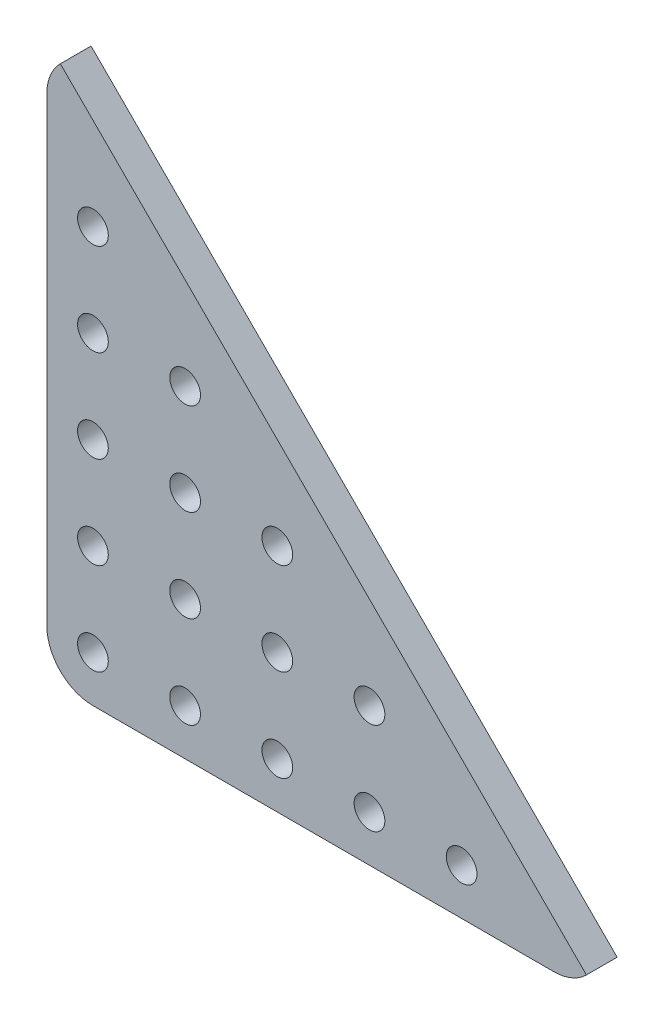
ISO-10303-21;
HEADER;
FILE_DESCRIPTION(('STEP AP214'),'2;1');
FILE_NAME('part.step','',(''),(''),'','','');
FILE_SCHEMA(('AUTOMOTIVE_DESIGN { 1 0 10303 214 1 1 1 1 }'));
ENDSEC;
DATA;
#1=APPLICATION_CONTEXT('core data for automotive mechanical design processes');
#2=APPLICATION_PROTOCOL_DEFINITION('international standard','automotive_design',2000,#1);
#3=PRODUCT_CONTEXT('',#1,'mechanical');
#4=PRODUCT('Part','Part','',(#3));
#5=PRODUCT_RELATED_PRODUCT_CATEGORY('part','',(#4));
#6=PRODUCT_DEFINITION_FORMATION('','',#4);
#7=PRODUCT_DEFINITION_CONTEXT('part definition',#1,'design');
#8=PRODUCT_DEFINITION('design','',#6,#7);
#9=PRODUCT_DEFINITION_SHAPE('','',#8);
#10=(LENGTH_UNIT() NAMED_UNIT(*) SI_UNIT(.MILLI.,.METRE.));
#11=(NAMED_UNIT(*) PLANE_ANGLE_UNIT() SI_UNIT($,.RADIAN.));
#12=(NAMED_UNIT(*) SI_UNIT($,.STERADIAN.) SOLID_ANGLE_UNIT());
#13=UNCERTAINTY_MEASURE_WITH_UNIT(LENGTH_MEASURE(1.E-05),#10,'distance_accuracy_value','');
#14=(GEOMETRIC_REPRESENTATION_CONTEXT(3) GLOBAL_UNCERTAINTY_ASSIGNED_CONTEXT((#13)) GLOBAL_UNIT_ASSIGNED_CONTEXT((#10,
#11,#12)) REPRESENTATION_CONTEXT('',''));
#15=CARTESIAN_POINT('',(0.,0.,0.));
#16=DIRECTION('',(0.,0.,1.));
#17=DIRECTION('',(1.,0.,0.));
#18=AXIS2_PLACEMENT_3D('',#15,#16,#17);
#19=CARTESIAN_POINT('',(-101.443383637,101.056539337921,3.));
#20=DIRECTION('',(0.,0.,1.));
#21=DIRECTION('',(1.,0.,0.));
#22=AXIS2_PLACEMENT_3D('',#19,#20,#21);
#23=PLANE('',#22);
#24=CARTESIAN_POINT('',(-74.443383637,56.056539338,3.));
#25=DIRECTION('',(0.,0.,1.));
#26=DIRECTION('',(1.,0.,0.));
#27=AXIS2_PLACEMENT_3D('',#24,#25,#26);
#28=CIRCLE('',#27,1.5);
#29=CARTESIAN_POINT('',(-72.943383637,56.056539338,3.));
#30=VERTEX_POINT('',#29);
#31=EDGE_CURVE('E234',#30,#30,#28,.T.);
#32=ORIENTED_EDGE('',*,*,#31,.F.);
#33=EDGE_LOOP('',(#32));
#34=FACE_BOUND('',#33,.T.);
#35=CARTESIAN_POINT('',(-92.443383637,56.056539338,3.));
#36=DIRECTION('',(0.,0.,1.));
#37=DIRECTION('',(1.,0.,0.));
#38=AXIS2_PLACEMENT_3D('',#35,#36,#37);
#39=CIRCLE('',#38,1.5);
#40=CARTESIAN_POINT('',(-90.943383637,56.056539338,3.));
#41=VERTEX_POINT('',#40);
#42=EDGE_CURVE('E246',#41,#41,#39,.T.);
#43=ORIENTED_EDGE('',*,*,#42,.F.);
#44=EDGE_LOOP('',(#43));
#45=FACE_BOUND('',#44,.T.);
#46=CARTESIAN_POINT('',(-74.443383637,65.056539338,3.));
#47=DIRECTION('',(0.,0.,1.));
#48=DIRECTION('',(1.,0.,0.));
#49=AXIS2_PLACEMENT_3D('',#46,#47,#48);
#50=CIRCLE('',#49,1.5);
#51=CARTESIAN_POINT('',(-72.943383637,65.056539338,3.));
#52=VERTEX_POINT('',#51);
#53=EDGE_CURVE('E258',#52,#52,#50,.T.);
#54=ORIENTED_EDGE('',*,*,#53,.F.);
#55=EDGE_LOOP('',(#54));
#56=FACE_BOUND('',#55,.T.);
#57=CARTESIAN_POINT('',(-92.443383637,65.056539338,3.));
#58=DIRECTION('',(0.,0.,1.));
#59=DIRECTION('',(1.,0.,0.));
#60=AXIS2_PLACEMENT_3D('',#57,#58,#59);
#61=CIRCLE('',#60,1.5);
#62=CARTESIAN_POINT('',(-90.943383637,65.056539338,3.));
#63=VERTEX_POINT('',#62);
#64=EDGE_CURVE('E270',#63,#63,#61,.T.);
#65=ORIENTED_EDGE('',*,*,#64,.F.);
#66=EDGE_LOOP('',(#65));
#67=FACE_BOUND('',#66,.T.);
#68=CARTESIAN_POINT('',(-83.443383637,74.056539338,3.));
#69=DIRECTION('',(0.,0.,1.));
#70=DIRECTION('',(1.,0.,0.));
#71=AXIS2_PLACEMENT_3D('',#68,#69,#70);
#72=CIRCLE('',#71,1.5);
#73=CARTESIAN_POINT('',(-81.943383637,74.056539338,3.));
#74=VERTEX_POINT('',#73);
#75=EDGE_CURVE('E282',#74,#74,#72,.T.);
#76=ORIENTED_EDGE('',*,*,#75,.F.);
#77=EDGE_LOOP('',(#76));
#78=FACE_BOUND('',#77,.T.);
#79=CARTESIAN_POINT('',(-101.443383637,74.056539338,3.));
#80=DIRECTION('',(0.,0.,1.));
#81=DIRECTION('',(1.,0.,0.));
#82=AXIS2_PLACEMENT_3D('',#79,#80,#81);
#83=CIRCLE('',#82,1.5);
#84=CARTESIAN_POINT('',(-99.943383637,74.056539338,3.));
#85=VERTEX_POINT('',#84);
#86=EDGE_CURVE('E294',#85,#85,#83,.T.);
#87=ORIENTED_EDGE('',*,*,#86,.F.);
#88=EDGE_LOOP('',(#87));
#89=FACE_BOUND('',#88,.T.);
#90=CARTESIAN_POINT('',(-101.443383637,83.056539338,3.));
#91=DIRECTION('',(0.,0.,1.));
#92=DIRECTION('',(1.,0.,0.));
#93=AXIS2_PLACEMENT_3D('',#90,#91,#92);
#94=CIRCLE('',#93,1.5);
#95=CARTESIAN_POINT('',(-99.943383637,83.056539338,3.));
#96=VERTEX_POINT('',#95);
#97=EDGE_CURVE('E306',#96,#96,#94,.T.);
#98=ORIENTED_EDGE('',*,*,#97,.F.);
#99=EDGE_LOOP('',(#98));
#100=FACE_BOUND('',#99,.T.);
#101=CARTESIAN_POINT('',(-101.443383637,101.056539337921,3.));
#102=DIRECTION('',(0.,0.,1.));
#103=DIRECTION('',(1.,0.,0.));
#104=AXIS2_PLACEMENT_3D('',#101,#102,#103);
#105=CIRCLE('',#104,4.50000000000001);
#106=CARTESIAN_POINT('',(-104.6253641523,104.2385198533,3.));
#107=VERTEX_POINT('',#106);
#108=CARTESIAN_POINT('',(-105.943383637,101.056539338,3.));
#109=VERTEX_POINT('',#108);
#110=EDGE_CURVE('E129',#107,#109,#105,.T.);
#111=ORIENTED_EDGE('',*,*,#110,.T.);
#112=DIRECTION('',(0.,-1.,0.));
#113=VECTOR('',#112,1.);
#114=CARTESIAN_POINT('',(-105.943383637,101.056539338,3.));
#115=LINE('',#114,#113);
#116=CARTESIAN_POINT('',(-105.943383637,56.056539338,3.));
#117=VERTEX_POINT('',#116);
#118=EDGE_CURVE('E87',#109,#117,#115,.T.);
#119=ORIENTED_EDGE('',*,*,#118,.T.);
#120=CARTESIAN_POINT('',(-101.443383637,56.056539338,3.));
#121=DIRECTION('',(0.,0.,1.));
#122=DIRECTION('',(1.,0.,0.));
#123=AXIS2_PLACEMENT_3D('',#120,#121,#122);
#124=CIRCLE('',#123,4.5);
#125=CARTESIAN_POINT('',(-101.443383637,51.556539338,3.));
#126=VERTEX_POINT('',#125);
#127=EDGE_CURVE('E100',#117,#126,#124,.T.);
#128=ORIENTED_EDGE('',*,*,#127,.T.);
#129=DIRECTION('',(1.,0.,0.));
#130=VECTOR('',#129,1.);
#131=CARTESIAN_POINT('',(-101.443383637,51.556539338,3.));
#132=LINE('',#131,#130);
#133=CARTESIAN_POINT('',(-56.443383637,51.556539338,3.));
#134=VERTEX_POINT('',#133);
#135=EDGE_CURVE('E94',#126,#134,#132,.T.);
#136=ORIENTED_EDGE('',*,*,#135,.T.);
#137=CARTESIAN_POINT('',(-56.4433836370789,56.056539338,3.));
#138=DIRECTION('',(0.,0.,1.));
#139=DIRECTION('',(1.,0.,0.));
#140=AXIS2_PLACEMENT_3D('',#137,#138,#139);
#141=CIRCLE('',#140,4.5);
#142=CARTESIAN_POINT('',(-53.2614031217,52.8745588227,3.));
#143=VERTEX_POINT('',#142);
#144=EDGE_CURVE('E98',#134,#143,#141,.T.);
#145=ORIENTED_EDGE('',*,*,#144,.T.);
#146=DIRECTION('',(-0.707106781186547,0.707106781186548,0.));
#147=VECTOR('',#146,1.);
#148=CARTESIAN_POINT('',(-104.6253641523,104.2385198533,3.));
#149=LINE('',#148,#147);
#150=EDGE_CURVE('E50',#143,#107,#149,.T.);
#151=ORIENTED_EDGE('',*,*,#150,.T.);
#152=EDGE_LOOP('',(#111,#119,#128,#136,#145,#151));
#153=FACE_BOUND('',#152,.T.);
#154=CARTESIAN_POINT('',(-101.443383637,92.056539338,3.));
#155=DIRECTION('',(0.,0.,1.));
#156=DIRECTION('',(1.,0.,0.));
#157=AXIS2_PLACEMENT_3D('',#154,#155,#156);
#158=CIRCLE('',#157,1.5);
#159=CARTESIAN_POINT('',(-99.943383637,92.056539338,3.));
#160=VERTEX_POINT('',#159);
#161=EDGE_CURVE('E122',#160,#160,#158,.T.);
#162=ORIENTED_EDGE('',*,*,#161,.F.);
#163=EDGE_LOOP('',(#162));
#164=FACE_BOUND('',#163,.T.);
#165=CARTESIAN_POINT('',(-92.443383637,83.056539338,3.));
#166=DIRECTION('',(0.,0.,1.));
#167=DIRECTION('',(1.,0.,0.));
#168=AXIS2_PLACEMENT_3D('',#165,#166,#167);
#169=CIRCLE('',#168,1.5);
#170=CARTESIAN_POINT('',(-90.943383637,83.056539338,3.));
#171=VERTEX_POINT('',#170);
#172=EDGE_CURVE('E300',#171,#171,#169,.T.);
#173=ORIENTED_EDGE('',*,*,#172,.F.);
#174=EDGE_LOOP('',(#173));
#175=FACE_BOUND('',#174,.T.);
#176=CARTESIAN_POINT('',(-92.443383637,74.056539338,3.));
#177=DIRECTION('',(0.,0.,1.));
#178=DIRECTION('',(1.,0.,0.));
#179=AXIS2_PLACEMENT_3D('',#176,#177,#178);
#180=CIRCLE('',#179,1.5);
#181=CARTESIAN_POINT('',(-90.943383637,74.056539338,3.));
#182=VERTEX_POINT('',#181);
#183=EDGE_CURVE('E288',#182,#182,#180,.T.);
#184=ORIENTED_EDGE('',*,*,#183,.F.);
#185=EDGE_LOOP('',(#184));
#186=FACE_BOUND('',#185,.T.);
#187=CARTESIAN_POINT('',(-101.443383637,65.056539338,3.));
#188=DIRECTION('',(0.,0.,1.));
#189=DIRECTION('',(1.,0.,0.));
#190=AXIS2_PLACEMENT_3D('',#187,#188,#189);
#191=CIRCLE('',#190,1.5);
#192=CARTESIAN_POINT('',(-99.943383637,65.056539338,3.));
#193=VERTEX_POINT('',#192);
#194=EDGE_CURVE('E276',#193,#193,#191,.T.);
#195=ORIENTED_EDGE('',*,*,#194,.F.);
#196=EDGE_LOOP('',(#195));
#197=FACE_BOUND('',#196,.T.);
#198=CARTESIAN_POINT('',(-83.443383637,65.056539338,3.));
#199=DIRECTION('',(0.,0.,1.));
#200=DIRECTION('',(1.,0.,0.));
#201=AXIS2_PLACEMENT_3D('',#198,#199,#200);
#202=CIRCLE('',#201,1.5);
#203=CARTESIAN_POINT('',(-81.943383637,65.056539338,3.));
#204=VERTEX_POINT('',#203);
#205=EDGE_CURVE('E264',#204,#204,#202,.T.);
#206=ORIENTED_EDGE('',*,*,#205,.F.);
#207=EDGE_LOOP('',(#206));
#208=FACE_BOUND('',#207,.T.);
#209=CARTESIAN_POINT('',(-101.443383637,56.056539338,3.));
#210=DIRECTION('',(0.,0.,1.));
#211=DIRECTION('',(1.,0.,0.));
#212=AXIS2_PLACEMENT_3D('',#209,#210,#211);
#213=CIRCLE('',#212,1.5);
#214=CARTESIAN_POINT('',(-99.943383637,56.056539338,3.));
#215=VERTEX_POINT('',#214);
#216=EDGE_CURVE('E252',#215,#215,#213,.T.);
#217=ORIENTED_EDGE('',*,*,#216,.F.);
#218=EDGE_LOOP('',(#217));
#219=FACE_BOUND('',#218,.T.);
#220=CARTESIAN_POINT('',(-83.443383637,56.056539338,3.));
#221=DIRECTION('',(0.,0.,1.));
#222=DIRECTION('',(1.,0.,0.));
#223=AXIS2_PLACEMENT_3D('',#220,#221,#222);
#224=CIRCLE('',#223,1.5);
#225=CARTESIAN_POINT('',(-81.943383637,56.056539338,3.));
#226=VERTEX_POINT('',#225);
#227=EDGE_CURVE('E240',#226,#226,#224,.T.);
#228=ORIENTED_EDGE('',*,*,#227,.F.);
#229=EDGE_LOOP('',(#228));
#230=FACE_BOUND('',#229,.T.);
#231=CARTESIAN_POINT('',(-65.443383637,56.056539338,3.));
#232=DIRECTION('',(0.,0.,1.));
#233=DIRECTION('',(1.,0.,0.));
#234=AXIS2_PLACEMENT_3D('',#231,#232,#233);
#235=CIRCLE('',#234,1.5);
#236=CARTESIAN_POINT('',(-63.943383637,56.056539338,3.));
#237=VERTEX_POINT('',#236);
#238=EDGE_CURVE('E225',#237,#237,#235,.T.);
#239=ORIENTED_EDGE('',*,*,#238,.F.);
#240=EDGE_LOOP('',(#239));
#241=FACE_BOUND('',#240,.T.);
#242=ADVANCED_FACE('F33',(#34,#45,#56,#67,#78,#89,#100,#153,#164,#175,#186,#197,#208,#219,#230,
#241),#23,.T.);
#243=CARTESIAN_POINT('',(-101.443383637,101.056539337921,0.));
#244=DIRECTION('',(0.,0.,1.));
#245=DIRECTION('',(1.,0.,0.));
#246=AXIS2_PLACEMENT_3D('',#243,#244,#245);
#247=PLANE('',#246);
#248=CARTESIAN_POINT('',(-74.443383637,56.056539338,0.));
#249=DIRECTION('',(0.,0.,1.));
#250=DIRECTION('',(1.,0.,0.));
#251=AXIS2_PLACEMENT_3D('',#248,#249,#250);
#252=CIRCLE('',#251,1.5);
#253=CARTESIAN_POINT('',(-72.943383637,56.056539338,0.));
#254=VERTEX_POINT('',#253);
#255=EDGE_CURVE('E231',#254,#254,#252,.T.);
#256=ORIENTED_EDGE('',*,*,#255,.T.);
#257=EDGE_LOOP('',(#256));
#258=FACE_BOUND('',#257,.T.);
#259=CARTESIAN_POINT('',(-92.443383637,56.056539338,0.));
#260=DIRECTION('',(0.,0.,1.));
#261=DIRECTION('',(1.,0.,0.));
#262=AXIS2_PLACEMENT_3D('',#259,#260,#261);
#263=CIRCLE('',#262,1.5);
#264=CARTESIAN_POINT('',(-90.943383637,56.056539338,0.));
#265=VERTEX_POINT('',#264);
#266=EDGE_CURVE('E243',#265,#265,#263,.T.);
#267=ORIENTED_EDGE('',*,*,#266,.T.);
#268=EDGE_LOOP('',(#267));
#269=FACE_BOUND('',#268,.T.);
#270=CARTESIAN_POINT('',(-74.443383637,65.056539338,0.));
#271=DIRECTION('',(0.,0.,1.));
#272=DIRECTION('',(1.,0.,0.));
#273=AXIS2_PLACEMENT_3D('',#270,#271,#272);
#274=CIRCLE('',#273,1.5);
#275=CARTESIAN_POINT('',(-72.943383637,65.056539338,0.));
#276=VERTEX_POINT('',#275);
#277=EDGE_CURVE('E255',#276,#276,#274,.T.);
#278=ORIENTED_EDGE('',*,*,#277,.T.);
#279=EDGE_LOOP('',(#278));
#280=FACE_BOUND('',#279,.T.);
#281=CARTESIAN_POINT('',(-92.443383637,65.056539338,0.));
#282=DIRECTION('',(0.,0.,1.));
#283=DIRECTION('',(1.,0.,0.));
#284=AXIS2_PLACEMENT_3D('',#281,#282,#283);
#285=CIRCLE('',#284,1.5);
#286=CARTESIAN_POINT('',(-90.943383637,65.056539338,0.));
#287=VERTEX_POINT('',#286);
#288=EDGE_CURVE('E267',#287,#287,#285,.T.);
#289=ORIENTED_EDGE('',*,*,#288,.T.);
#290=EDGE_LOOP('',(#289));
#291=FACE_BOUND('',#290,.T.);
#292=CARTESIAN_POINT('',(-83.443383637,74.056539338,0.));
#293=DIRECTION('',(0.,0.,1.));
#294=DIRECTION('',(1.,0.,0.));
#295=AXIS2_PLACEMENT_3D('',#292,#293,#294);
#296=CIRCLE('',#295,1.5);
#297=CARTESIAN_POINT('',(-81.943383637,74.056539338,0.));
#298=VERTEX_POINT('',#297);
#299=EDGE_CURVE('E279',#298,#298,#296,.T.);
#300=ORIENTED_EDGE('',*,*,#299,.T.);
#301=EDGE_LOOP('',(#300));
#302=FACE_BOUND('',#301,.T.);
#303=CARTESIAN_POINT('',(-101.443383637,74.056539338,0.));
#304=DIRECTION('',(0.,0.,1.));
#305=DIRECTION('',(1.,0.,0.));
#306=AXIS2_PLACEMENT_3D('',#303,#304,#305);
#307=CIRCLE('',#306,1.5);
#308=CARTESIAN_POINT('',(-99.943383637,74.056539338,0.));
#309=VERTEX_POINT('',#308);
#310=EDGE_CURVE('E291',#309,#309,#307,.T.);
#311=ORIENTED_EDGE('',*,*,#310,.T.);
#312=EDGE_LOOP('',(#311));
#313=FACE_BOUND('',#312,.T.);
#314=CARTESIAN_POINT('',(-101.443383637,83.056539338,0.));
#315=DIRECTION('',(0.,0.,1.));
#316=DIRECTION('',(1.,0.,0.));
#317=AXIS2_PLACEMENT_3D('',#314,#315,#316);
#318=CIRCLE('',#317,1.5);
#319=CARTESIAN_POINT('',(-99.943383637,83.056539338,0.));
#320=VERTEX_POINT('',#319);
#321=EDGE_CURVE('E303',#320,#320,#318,.T.);
#322=ORIENTED_EDGE('',*,*,#321,.T.);
#323=EDGE_LOOP('',(#322));
#324=FACE_BOUND('',#323,.T.);
#325=CARTESIAN_POINT('',(-101.443383637,101.056539337921,0.));
#326=DIRECTION('',(0.,0.,1.));
#327=DIRECTION('',(1.,0.,0.));
#328=AXIS2_PLACEMENT_3D('',#325,#326,#327);
#329=CIRCLE('',#328,4.50000000000001);
#330=CARTESIAN_POINT('',(-104.6253641523,104.2385198533,0.));
#331=VERTEX_POINT('',#330);
#332=CARTESIAN_POINT('',(-105.943383637,101.056539338,0.));
#333=VERTEX_POINT('',#332);
#334=EDGE_CURVE('E118',#331,#333,#329,.T.);
#335=ORIENTED_EDGE('',*,*,#334,.F.);
#336=DIRECTION('',(-0.707106781186547,0.707106781186548,0.));
#337=VECTOR('',#336,1.);
#338=CARTESIAN_POINT('',(-104.6253641523,104.2385198533,0.));
#339=LINE('',#338,#337);
#340=CARTESIAN_POINT('',(-53.2614031217,52.8745588227,0.));
#341=VERTEX_POINT('',#340);
#342=EDGE_CURVE('E79',#341,#331,#339,.T.);
#343=ORIENTED_EDGE('',*,*,#342,.F.);
#344=CARTESIAN_POINT('',(-56.4433836370789,56.056539338,0.));
#345=DIRECTION('',(0.,0.,1.));
#346=DIRECTION('',(1.,0.,0.));
#347=AXIS2_PLACEMENT_3D('',#344,#345,#346);
#348=CIRCLE('',#347,4.5);
#349=CARTESIAN_POINT('',(-56.443383637,51.556539338,0.));
#350=VERTEX_POINT('',#349);
#351=EDGE_CURVE('E73',#350,#341,#348,.T.);
#352=ORIENTED_EDGE('',*,*,#351,.F.);
#353=DIRECTION('',(1.,0.,0.));
#354=VECTOR('',#353,1.);
#355=CARTESIAN_POINT('',(-101.443383637,51.556539338,0.));
#356=LINE('',#355,#354);
#357=CARTESIAN_POINT('',(-101.443383637,51.556539338,0.));
#358=VERTEX_POINT('',#357);
#359=EDGE_CURVE('E108',#358,#350,#356,.T.);
#360=ORIENTED_EDGE('',*,*,#359,.F.);
#361=CARTESIAN_POINT('',(-101.443383637,56.056539338,0.));
#362=DIRECTION('',(0.,0.,1.));
#363=DIRECTION('',(1.,0.,0.));
#364=AXIS2_PLACEMENT_3D('',#361,#362,#363);
#365=CIRCLE('',#364,4.5);
#366=CARTESIAN_POINT('',(-105.943383637,56.056539338,0.));
#367=VERTEX_POINT('',#366);
#368=EDGE_CURVE('E124',#367,#358,#365,.T.);
#369=ORIENTED_EDGE('',*,*,#368,.F.);
#370=DIRECTION('',(0.,-1.,0.));
#371=VECTOR('',#370,1.);
#372=CARTESIAN_POINT('',(-105.943383637,101.056539338,0.));
#373=LINE('',#372,#371);
#374=EDGE_CURVE('E121',#333,#367,#373,.T.);
#375=ORIENTED_EDGE('',*,*,#374,.F.);
#376=EDGE_LOOP('',(#335,#343,#352,#360,#369,#375));
#377=FACE_BOUND('',#376,.T.);
#378=CARTESIAN_POINT('',(-101.443383637,92.056539338,0.));
#379=DIRECTION('',(0.,0.,1.));
#380=DIRECTION('',(1.,0.,0.));
#381=AXIS2_PLACEMENT_3D('',#378,#379,#380);
#382=CIRCLE('',#381,1.5);
#383=CARTESIAN_POINT('',(-99.943383637,92.056539338,0.));
#384=VERTEX_POINT('',#383);
#385=EDGE_CURVE('E309',#384,#384,#382,.T.);
#386=ORIENTED_EDGE('',*,*,#385,.T.);
#387=EDGE_LOOP('',(#386));
#388=FACE_BOUND('',#387,.T.);
#389=CARTESIAN_POINT('',(-92.443383637,83.056539338,0.));
#390=DIRECTION('',(0.,0.,1.));
#391=DIRECTION('',(1.,0.,0.));
#392=AXIS2_PLACEMENT_3D('',#389,#390,#391);
#393=CIRCLE('',#392,1.5);
#394=CARTESIAN_POINT('',(-90.943383637,83.056539338,0.));
#395=VERTEX_POINT('',#394);
#396=EDGE_CURVE('E297',#395,#395,#393,.T.);
#397=ORIENTED_EDGE('',*,*,#396,.T.);
#398=EDGE_LOOP('',(#397));
#399=FACE_BOUND('',#398,.T.);
#400=CARTESIAN_POINT('',(-92.443383637,74.056539338,0.));
#401=DIRECTION('',(0.,0.,1.));
#402=DIRECTION('',(1.,0.,0.));
#403=AXIS2_PLACEMENT_3D('',#400,#401,#402);
#404=CIRCLE('',#403,1.5);
#405=CARTESIAN_POINT('',(-90.943383637,74.056539338,0.));
#406=VERTEX_POINT('',#405);
#407=EDGE_CURVE('E285',#406,#406,#404,.T.);
#408=ORIENTED_EDGE('',*,*,#407,.T.);
#409=EDGE_LOOP('',(#408));
#410=FACE_BOUND('',#409,.T.);
#411=CARTESIAN_POINT('',(-101.443383637,65.056539338,0.));
#412=DIRECTION('',(0.,0.,1.));
#413=DIRECTION('',(1.,0.,0.));
#414=AXIS2_PLACEMENT_3D('',#411,#412,#413);
#415=CIRCLE('',#414,1.5);
#416=CARTESIAN_POINT('',(-99.943383637,65.056539338,0.));
#417=VERTEX_POINT('',#416);
#418=EDGE_CURVE('E273',#417,#417,#415,.T.);
#419=ORIENTED_EDGE('',*,*,#418,.T.);
#420=EDGE_LOOP('',(#419));
#421=FACE_BOUND('',#420,.T.);
#422=CARTESIAN_POINT('',(-83.443383637,65.056539338,0.));
#423=DIRECTION('',(0.,0.,1.));
#424=DIRECTION('',(1.,0.,0.));
#425=AXIS2_PLACEMENT_3D('',#422,#423,#424);
#426=CIRCLE('',#425,1.5);
#427=CARTESIAN_POINT('',(-81.943383637,65.056539338,0.));
#428=VERTEX_POINT('',#427);
#429=EDGE_CURVE('E261',#428,#428,#426,.T.);
#430=ORIENTED_EDGE('',*,*,#429,.T.);
#431=EDGE_LOOP('',(#430));
#432=FACE_BOUND('',#431,.T.);
#433=CARTESIAN_POINT('',(-101.443383637,56.056539338,0.));
#434=DIRECTION('',(0.,0.,1.));
#435=DIRECTION('',(1.,0.,0.));
#436=AXIS2_PLACEMENT_3D('',#433,#434,#435);
#437=CIRCLE('',#436,1.5);
#438=CARTESIAN_POINT('',(-99.943383637,56.056539338,0.));
#439=VERTEX_POINT('',#438);
#440=EDGE_CURVE('E249',#439,#439,#437,.T.);
#441=ORIENTED_EDGE('',*,*,#440,.T.);
#442=EDGE_LOOP('',(#441));
#443=FACE_BOUND('',#442,.T.);
#444=CARTESIAN_POINT('',(-83.443383637,56.056539338,0.));
#445=DIRECTION('',(0.,0.,1.));
#446=DIRECTION('',(1.,0.,0.));
#447=AXIS2_PLACEMENT_3D('',#444,#445,#446);
#448=CIRCLE('',#447,1.5);
#449=CARTESIAN_POINT('',(-81.943383637,56.056539338,0.));
#450=VERTEX_POINT('',#449);
#451=EDGE_CURVE('E237',#450,#450,#448,.T.);
#452=ORIENTED_EDGE('',*,*,#451,.T.);
#453=EDGE_LOOP('',(#452));
#454=FACE_BOUND('',#453,.T.);
#455=CARTESIAN_POINT('',(-65.443383637,56.056539338,0.));
#456=DIRECTION('',(0.,0.,1.));
#457=DIRECTION('',(1.,0.,0.));
#458=AXIS2_PLACEMENT_3D('',#455,#456,#457);
#459=CIRCLE('',#458,1.5);
#460=CARTESIAN_POINT('',(-63.943383637,56.056539338,0.));
#461=VERTEX_POINT('',#460);
#462=EDGE_CURVE('E228',#461,#461,#459,.T.);
#463=ORIENTED_EDGE('',*,*,#462,.T.);
#464=EDGE_LOOP('',(#463));
#465=FACE_BOUND('',#464,.T.);
#466=ADVANCED_FACE('F138',(#258,#269,#280,#291,#302,#313,#324,#377,#388,#399,#410,#421,#432,
#443,#454,#465),#247,.F.);
#467=CARTESIAN_POINT('',(-101.443383637,101.056539337921,3.));
#468=DIRECTION('',(0.,0.,-1.));
#469=DIRECTION('',(-1.,0.,0.));
#470=AXIS2_PLACEMENT_3D('',#467,#468,#469);
#471=CYLINDRICAL_SURFACE('',#470,4.50000000000001);
#472=ORIENTED_EDGE('',*,*,#334,.T.);
#473=DIRECTION('',(0.,0.,-1.));
#474=VECTOR('',#473,1.);
#475=CARTESIAN_POINT('',(-105.943383637,101.056539338,3.));
#476=LINE('',#475,#474);
#477=EDGE_CURVE('E11',#109,#333,#476,.T.);
#478=ORIENTED_EDGE('',*,*,#477,.F.);
#479=ORIENTED_EDGE('',*,*,#110,.F.);
#480=DIRECTION('',(0.,0.,-1.));
#481=VECTOR('',#480,1.);
#482=CARTESIAN_POINT('',(-104.6253641523,104.2385198533,3.));
#483=LINE('',#482,#481);
#484=EDGE_CURVE('E114',#107,#331,#483,.T.);
#485=ORIENTED_EDGE('',*,*,#484,.T.);
#486=EDGE_LOOP('',(#472,#478,#479,#485));
#487=FACE_BOUND('',#486,.T.);
#488=ADVANCED_FACE('F35',(#487),#471,.T.);
#489=CARTESIAN_POINT('',(-105.943383637,101.056539338,3.));
#490=DIRECTION('',(1.,0.,0.));
#491=DIRECTION('',(0.,0.,-1.));
#492=AXIS2_PLACEMENT_3D('',#489,#490,#491);
#493=PLANE('',#492);
#494=ORIENTED_EDGE('',*,*,#374,.T.);
#495=DIRECTION('',(0.,0.,-1.));
#496=VECTOR('',#495,1.);
#497=CARTESIAN_POINT('',(-105.943383637,56.056539338,3.));
#498=LINE('',#497,#496);
#499=EDGE_CURVE('E42',#117,#367,#498,.T.);
#500=ORIENTED_EDGE('',*,*,#499,.F.);
#501=ORIENTED_EDGE('',*,*,#118,.F.);
#502=ORIENTED_EDGE('',*,*,#477,.T.);
#503=EDGE_LOOP('',(#494,#500,#501,#502));
#504=FACE_BOUND('',#503,.T.);
#505=ADVANCED_FACE('F465',(#504),#493,.F.);
#506=CARTESIAN_POINT('',(-101.443383637,56.056539338,3.));
#507=DIRECTION('',(0.,0.,-1.));
#508=DIRECTION('',(-1.,0.,0.));
#509=AXIS2_PLACEMENT_3D('',#506,#507,#508);
#510=CYLINDRICAL_SURFACE('',#509,4.5);
#511=ORIENTED_EDGE('',*,*,#368,.T.);
#512=DIRECTION('',(0.,0.,-1.));
#513=VECTOR('',#512,1.);
#514=CARTESIAN_POINT('',(-101.443383637,51.556539338,3.));
#515=LINE('',#514,#513);
#516=EDGE_CURVE('E109',#126,#358,#515,.T.);
#517=ORIENTED_EDGE('',*,*,#516,.F.);
#518=ORIENTED_EDGE('',*,*,#127,.F.);
#519=ORIENTED_EDGE('',*,*,#499,.T.);
#520=EDGE_LOOP('',(#511,#517,#518,#519));
#521=FACE_BOUND('',#520,.T.);
#522=ADVANCED_FACE('F135',(#521),#510,.T.);
#523=CARTESIAN_POINT('',(-101.443383637,51.556539338,3.));
#524=DIRECTION('',(0.,1.,0.));
#525=DIRECTION('',(0.,0.,1.));
#526=AXIS2_PLACEMENT_3D('',#523,#524,#525);
#527=PLANE('',#526);
#528=ORIENTED_EDGE('',*,*,#359,.T.);
#529=DIRECTION('',(0.,0.,-1.));
#530=VECTOR('',#529,1.);
#531=CARTESIAN_POINT('',(-56.443383637,51.556539338,3.));
#532=LINE('',#531,#530);
#533=EDGE_CURVE('E105',#134,#350,#532,.T.);
#534=ORIENTED_EDGE('',*,*,#533,.F.);
#535=ORIENTED_EDGE('',*,*,#135,.F.);
#536=ORIENTED_EDGE('',*,*,#516,.T.);
#537=EDGE_LOOP('',(#528,#534,#535,#536));
#538=FACE_BOUND('',#537,.T.);
#539=ADVANCED_FACE('F106',(#538),#527,.F.);
#540=CARTESIAN_POINT('',(-56.4433836370789,56.056539338,3.));
#541=DIRECTION('',(0.,0.,-1.));
#542=DIRECTION('',(-1.,0.,0.));
#543=AXIS2_PLACEMENT_3D('',#540,#541,#542);
#544=CYLINDRICAL_SURFACE('',#543,4.5);
#545=ORIENTED_EDGE('',*,*,#351,.T.);
#546=DIRECTION('',(0.,0.,-1.));
#547=VECTOR('',#546,1.);
#548=CARTESIAN_POINT('',(-53.2614031217,52.8745588227,3.));
#549=LINE('',#548,#547);
#550=EDGE_CURVE('E110',#143,#341,#549,.T.);
#551=ORIENTED_EDGE('',*,*,#550,.F.);
#552=ORIENTED_EDGE('',*,*,#144,.F.);
#553=ORIENTED_EDGE('',*,*,#533,.T.);
#554=EDGE_LOOP('',(#545,#551,#552,#553));
#555=FACE_BOUND('',#554,.T.);
#556=ADVANCED_FACE('F112',(#555),#544,.T.);
#557=CARTESIAN_POINT('',(-104.6253641523,104.2385198533,3.));
#558=DIRECTION('',(-0.707106781186548,-0.707106781186547,0.));
#559=DIRECTION('',(0.707106781186547,-0.707106781186548,0.));
#560=AXIS2_PLACEMENT_3D('',#557,#558,#559);
#561=PLANE('',#560);
#562=ORIENTED_EDGE('',*,*,#342,.T.);
#563=ORIENTED_EDGE('',*,*,#484,.F.);
#564=ORIENTED_EDGE('',*,*,#150,.F.);
#565=ORIENTED_EDGE('',*,*,#550,.T.);
#566=EDGE_LOOP('',(#562,#563,#564,#565));
#567=FACE_BOUND('',#566,.T.);
#568=ADVANCED_FACE('F143',(#567),#561,.F.);
#569=CARTESIAN_POINT('',(-101.443383637,92.056539338,3.));
#570=DIRECTION('',(0.,0.,-1.));
#571=DIRECTION('',(-1.,0.,0.));
#572=AXIS2_PLACEMENT_3D('',#569,#570,#571);
#573=CYLINDRICAL_SURFACE('',#572,1.5);
#574=ORIENTED_EDGE('',*,*,#161,.T.);
#575=EDGE_LOOP('',(#574));
#576=FACE_BOUND('',#575,.T.);
#577=ORIENTED_EDGE('',*,*,#385,.F.);
#578=EDGE_LOOP('',(#577));
#579=FACE_BOUND('',#578,.T.);
#580=ADVANCED_FACE('F145',(#576,#579),#573,.F.);
#581=CARTESIAN_POINT('',(-101.443383637,83.056539338,3.));
#582=DIRECTION('',(0.,0.,-1.));
#583=DIRECTION('',(-1.,0.,0.));
#584=AXIS2_PLACEMENT_3D('',#581,#582,#583);
#585=CYLINDRICAL_SURFACE('',#584,1.5);
#586=ORIENTED_EDGE('',*,*,#97,.T.);
#587=EDGE_LOOP('',(#586));
#588=FACE_BOUND('',#587,.T.);
#589=ORIENTED_EDGE('',*,*,#321,.F.);
#590=EDGE_LOOP('',(#589));
#591=FACE_BOUND('',#590,.T.);
#592=ADVANCED_FACE('F151',(#588,#591),#585,.F.);
#593=CARTESIAN_POINT('',(-92.443383637,83.056539338,3.));
#594=DIRECTION('',(0.,0.,-1.));
#595=DIRECTION('',(-1.,0.,0.));
#596=AXIS2_PLACEMENT_3D('',#593,#594,#595);
#597=CYLINDRICAL_SURFACE('',#596,1.5);
#598=ORIENTED_EDGE('',*,*,#172,.T.);
#599=EDGE_LOOP('',(#598));
#600=FACE_BOUND('',#599,.T.);
#601=ORIENTED_EDGE('',*,*,#396,.F.);
#602=EDGE_LOOP('',(#601));
#603=FACE_BOUND('',#602,.T.);
#604=ADVANCED_FACE('F168',(#600,#603),#597,.F.);
#605=CARTESIAN_POINT('',(-101.443383637,74.056539338,3.));
#606=DIRECTION('',(0.,0.,-1.));
#607=DIRECTION('',(-1.,0.,0.));
#608=AXIS2_PLACEMENT_3D('',#605,#606,#607);
#609=CYLINDRICAL_SURFACE('',#608,1.5);
#610=ORIENTED_EDGE('',*,*,#86,.T.);
#611=EDGE_LOOP('',(#610));
#612=FACE_BOUND('',#611,.T.);
#613=ORIENTED_EDGE('',*,*,#310,.F.);
#614=EDGE_LOOP('',(#613));
#615=FACE_BOUND('',#614,.T.);
#616=ADVANCED_FACE('F172',(#612,#615),#609,.F.);
#617=CARTESIAN_POINT('',(-92.443383637,74.056539338,3.));
#618=DIRECTION('',(0.,0.,-1.));
#619=DIRECTION('',(-1.,0.,0.));
#620=AXIS2_PLACEMENT_3D('',#617,#618,#619);
#621=CYLINDRICAL_SURFACE('',#620,1.5);
#622=ORIENTED_EDGE('',*,*,#183,.T.);
#623=EDGE_LOOP('',(#622));
#624=FACE_BOUND('',#623,.T.);
#625=ORIENTED_EDGE('',*,*,#407,.F.);
#626=EDGE_LOOP('',(#625));
#627=FACE_BOUND('',#626,.T.);
#628=ADVANCED_FACE('F176',(#624,#627),#621,.F.);
#629=CARTESIAN_POINT('',(-83.443383637,74.056539338,3.));
#630=DIRECTION('',(0.,0.,-1.));
#631=DIRECTION('',(-1.,0.,0.));
#632=AXIS2_PLACEMENT_3D('',#629,#630,#631);
#633=CYLINDRICAL_SURFACE('',#632,1.5);
#634=ORIENTED_EDGE('',*,*,#75,.T.);
#635=EDGE_LOOP('',(#634));
#636=FACE_BOUND('',#635,.T.);
#637=ORIENTED_EDGE('',*,*,#299,.F.);
#638=EDGE_LOOP('',(#637));
#639=FACE_BOUND('',#638,.T.);
#640=ADVANCED_FACE('F180',(#636,#639),#633,.F.);
#641=CARTESIAN_POINT('',(-101.443383637,65.056539338,3.));
#642=DIRECTION('',(0.,0.,-1.));
#643=DIRECTION('',(-1.,0.,0.));
#644=AXIS2_PLACEMENT_3D('',#641,#642,#643);
#645=CYLINDRICAL_SURFACE('',#644,1.5);
#646=ORIENTED_EDGE('',*,*,#194,.T.);
#647=EDGE_LOOP('',(#646));
#648=FACE_BOUND('',#647,.T.);
#649=ORIENTED_EDGE('',*,*,#418,.F.);
#650=EDGE_LOOP('',(#649));
#651=FACE_BOUND('',#650,.T.);
#652=ADVANCED_FACE('F184',(#648,#651),#645,.F.);
#653=CARTESIAN_POINT('',(-92.443383637,65.056539338,3.));
#654=DIRECTION('',(0.,0.,-1.));
#655=DIRECTION('',(-1.,0.,0.));
#656=AXIS2_PLACEMENT_3D('',#653,#654,#655);
#657=CYLINDRICAL_SURFACE('',#656,1.5);
#658=ORIENTED_EDGE('',*,*,#64,.T.);
#659=EDGE_LOOP('',(#658));
#660=FACE_BOUND('',#659,.T.);
#661=ORIENTED_EDGE('',*,*,#288,.F.);
#662=EDGE_LOOP('',(#661));
#663=FACE_BOUND('',#662,.T.);
#664=ADVANCED_FACE('F188',(#660,#663),#657,.F.);
#665=CARTESIAN_POINT('',(-83.443383637,65.056539338,3.));
#666=DIRECTION('',(0.,0.,-1.));
#667=DIRECTION('',(-1.,0.,0.));
#668=AXIS2_PLACEMENT_3D('',#665,#666,#667);
#669=CYLINDRICAL_SURFACE('',#668,1.5);
#670=ORIENTED_EDGE('',*,*,#205,.T.);
#671=EDGE_LOOP('',(#670));
#672=FACE_BOUND('',#671,.T.);
#673=ORIENTED_EDGE('',*,*,#429,.F.);
#674=EDGE_LOOP('',(#673));
#675=FACE_BOUND('',#674,.T.);
#676=ADVANCED_FACE('F192',(#672,#675),#669,.F.);
#677=CARTESIAN_POINT('',(-74.443383637,65.056539338,3.));
#678=DIRECTION('',(0.,0.,-1.));
#679=DIRECTION('',(-1.,0.,0.));
#680=AXIS2_PLACEMENT_3D('',#677,#678,#679);
#681=CYLINDRICAL_SURFACE('',#680,1.5);
#682=ORIENTED_EDGE('',*,*,#53,.T.);
#683=EDGE_LOOP('',(#682));
#684=FACE_BOUND('',#683,.T.);
#685=ORIENTED_EDGE('',*,*,#277,.F.);
#686=EDGE_LOOP('',(#685));
#687=FACE_BOUND('',#686,.T.);
#688=ADVANCED_FACE('F196',(#684,#687),#681,.F.);
#689=CARTESIAN_POINT('',(-101.443383637,56.056539338,3.));
#690=DIRECTION('',(0.,0.,-1.));
#691=DIRECTION('',(-1.,0.,0.));
#692=AXIS2_PLACEMENT_3D('',#689,#690,#691);
#693=CYLINDRICAL_SURFACE('',#692,1.5);
#694=ORIENTED_EDGE('',*,*,#216,.T.);
#695=EDGE_LOOP('',(#694));
#696=FACE_BOUND('',#695,.T.);
#697=ORIENTED_EDGE('',*,*,#440,.F.);
#698=EDGE_LOOP('',(#697));
#699=FACE_BOUND('',#698,.T.);
#700=ADVANCED_FACE('F200',(#696,#699),#693,.F.);
#701=CARTESIAN_POINT('',(-92.443383637,56.056539338,3.));
#702=DIRECTION('',(0.,0.,-1.));
#703=DIRECTION('',(-1.,0.,0.));
#704=AXIS2_PLACEMENT_3D('',#701,#702,#703);
#705=CYLINDRICAL_SURFACE('',#704,1.5);
#706=ORIENTED_EDGE('',*,*,#42,.T.);
#707=EDGE_LOOP('',(#706));
#708=FACE_BOUND('',#707,.T.);
#709=ORIENTED_EDGE('',*,*,#266,.F.);
#710=EDGE_LOOP('',(#709));
#711=FACE_BOUND('',#710,.T.);
#712=ADVANCED_FACE('F204',(#708,#711),#705,.F.);
#713=CARTESIAN_POINT('',(-83.443383637,56.056539338,3.));
#714=DIRECTION('',(0.,0.,-1.));
#715=DIRECTION('',(-1.,0.,0.));
#716=AXIS2_PLACEMENT_3D('',#713,#714,#715);
#717=CYLINDRICAL_SURFACE('',#716,1.5);
#718=ORIENTED_EDGE('',*,*,#227,.T.);
#719=EDGE_LOOP('',(#718));
#720=FACE_BOUND('',#719,.T.);
#721=ORIENTED_EDGE('',*,*,#451,.F.);
#722=EDGE_LOOP('',(#721));
#723=FACE_BOUND('',#722,.T.);
#724=ADVANCED_FACE('F208',(#720,#723),#717,.F.);
#725=CARTESIAN_POINT('',(-74.443383637,56.056539338,3.));
#726=DIRECTION('',(0.,0.,-1.));
#727=DIRECTION('',(-1.,0.,0.));
#728=AXIS2_PLACEMENT_3D('',#725,#726,#727);
#729=CYLINDRICAL_SURFACE('',#728,1.5);
#730=ORIENTED_EDGE('',*,*,#31,.T.);
#731=EDGE_LOOP('',(#730));
#732=FACE_BOUND('',#731,.T.);
#733=ORIENTED_EDGE('',*,*,#255,.F.);
#734=EDGE_LOOP('',(#733));
#735=FACE_BOUND('',#734,.T.);
#736=ADVANCED_FACE('F212',(#732,#735),#729,.F.);
#737=CARTESIAN_POINT('',(-65.443383637,56.056539338,3.));
#738=DIRECTION('',(0.,0.,-1.));
#739=DIRECTION('',(-1.,0.,0.));
#740=AXIS2_PLACEMENT_3D('',#737,#738,#739);
#741=CYLINDRICAL_SURFACE('',#740,1.5);
#742=ORIENTED_EDGE('',*,*,#238,.T.);
#743=EDGE_LOOP('',(#742));
#744=FACE_BOUND('',#743,.T.);
#745=ORIENTED_EDGE('',*,*,#462,.F.);
#746=EDGE_LOOP('',(#745));
#747=FACE_BOUND('',#746,.T.);
#748=ADVANCED_FACE('F216',(#744,#747),#741,.F.);
#749=CLOSED_SHELL('',(#242,#466,#488,#505,#522,#539,#556,#568,#580,#592,#604,#616,#628,#640,
#652,#664,#676,#688,#700,#712,#724,#736,#748));
#750=MANIFOLD_SOLID_BREP('B2',#749);
#751=ADVANCED_BREP_SHAPE_REPRESENTATION('',(#18,#750),#14);
#752=SHAPE_DEFINITION_REPRESENTATION(#9,#751);
ENDSEC;
END-ISO-10303-21;
